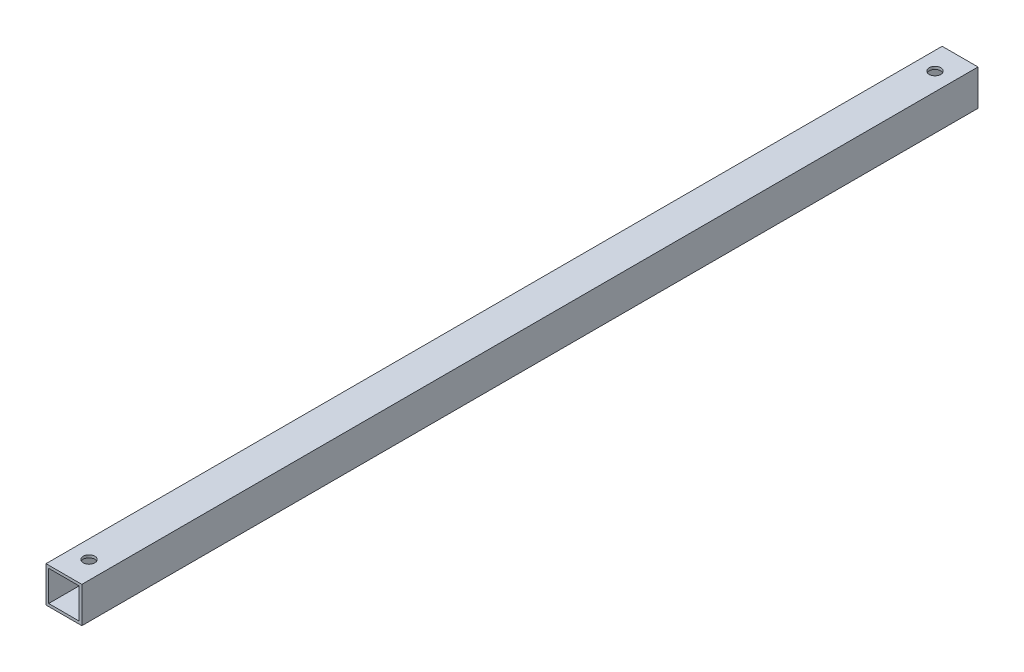
ISO-10303-21;
HEADER;
FILE_DESCRIPTION(('STEP AP214'),'2;1');
FILE_NAME('part.step','',(''),(''),'','','');
FILE_SCHEMA(('AUTOMOTIVE_DESIGN { 1 0 10303 214 1 1 1 1 }'));
ENDSEC;
DATA;
#1=APPLICATION_CONTEXT('core data for automotive mechanical design processes');
#2=APPLICATION_PROTOCOL_DEFINITION('international standard','automotive_design',2000,#1);
#3=PRODUCT_CONTEXT('',#1,'mechanical');
#4=PRODUCT('Part','Part','',(#3));
#5=PRODUCT_RELATED_PRODUCT_CATEGORY('part','',(#4));
#6=PRODUCT_DEFINITION_FORMATION('','',#4);
#7=PRODUCT_DEFINITION_CONTEXT('part definition',#1,'design');
#8=PRODUCT_DEFINITION('design','',#6,#7);
#9=PRODUCT_DEFINITION_SHAPE('','',#8);
#10=(LENGTH_UNIT() NAMED_UNIT(*) SI_UNIT(.MILLI.,.METRE.));
#11=(NAMED_UNIT(*) PLANE_ANGLE_UNIT() SI_UNIT($,.RADIAN.));
#12=(NAMED_UNIT(*) SI_UNIT($,.STERADIAN.) SOLID_ANGLE_UNIT());
#13=UNCERTAINTY_MEASURE_WITH_UNIT(LENGTH_MEASURE(1.E-05),#10,'distance_accuracy_value','');
#14=(GEOMETRIC_REPRESENTATION_CONTEXT(3) GLOBAL_UNCERTAINTY_ASSIGNED_CONTEXT((#13)) GLOBAL_UNIT_ASSIGNED_CONTEXT((#10,
#11,#12)) REPRESENTATION_CONTEXT('',''));
#15=CARTESIAN_POINT('',(0.,0.,0.));
#16=DIRECTION('',(0.,0.,1.));
#17=DIRECTION('',(1.,0.,0.));
#18=AXIS2_PLACEMENT_3D('',#15,#16,#17);
#19=CARTESIAN_POINT('',(-10.,-10.,-250.));
#20=DIRECTION('',(-1.,0.,0.));
#21=DIRECTION('',(0.,0.,1.));
#22=AXIS2_PLACEMENT_3D('',#19,#20,#21);
#23=PLANE('',#22);
#24=DIRECTION('',(0.,-1.,0.));
#25=VECTOR('',#24,1.);
#26=CARTESIAN_POINT('',(-10.,-10.,250.));
#27=LINE('',#26,#25);
#28=CARTESIAN_POINT('',(-10.,9.99999999999995,250.));
#29=VERTEX_POINT('',#28);
#30=CARTESIAN_POINT('',(-10.,-10.,250.));
#31=VERTEX_POINT('',#30);
#32=EDGE_CURVE('E134',#29,#31,#27,.T.);
#33=ORIENTED_EDGE('',*,*,#32,.F.);
#34=DIRECTION('',(0.,0.,1.));
#35=VECTOR('',#34,1.);
#36=CARTESIAN_POINT('',(-10.,9.99999999999995,-250.));
#37=LINE('',#36,#35);
#38=CARTESIAN_POINT('',(-10.,9.99999999999995,-250.));
#39=VERTEX_POINT('',#38);
#40=EDGE_CURVE('E11',#39,#29,#37,.T.);
#41=ORIENTED_EDGE('',*,*,#40,.F.);
#42=DIRECTION('',(0.,-1.,0.));
#43=VECTOR('',#42,1.);
#44=CARTESIAN_POINT('',(-10.,-10.,-250.));
#45=LINE('',#44,#43);
#46=CARTESIAN_POINT('',(-10.,-10.,-250.));
#47=VERTEX_POINT('',#46);
#48=EDGE_CURVE('E138',#39,#47,#45,.T.);
#49=ORIENTED_EDGE('',*,*,#48,.T.);
#50=DIRECTION('',(0.,0.,1.));
#51=VECTOR('',#50,1.);
#52=CARTESIAN_POINT('',(-10.,-10.,-250.));
#53=LINE('',#52,#51);
#54=EDGE_CURVE('E151',#47,#31,#53,.T.);
#55=ORIENTED_EDGE('',*,*,#54,.T.);
#56=EDGE_LOOP('',(#33,#41,#49,#55));
#57=FACE_BOUND('',#56,.T.);
#58=ADVANCED_FACE('F33',(#57),#23,.T.);
#59=CARTESIAN_POINT('',(9.99999999999997,9.99999999999995,-250.));
#60=DIRECTION('',(0.,1.,0.));
#61=DIRECTION('',(0.,0.,1.));
#62=AXIS2_PLACEMENT_3D('',#59,#60,#61);
#63=PLANE('',#62);
#64=CARTESIAN_POINT('',(0.,9.99999999999995,-236.));
#65=DIRECTION('',(0.,1.,0.));
#66=DIRECTION('',(0.,0.,1.));
#67=AXIS2_PLACEMENT_3D('',#64,#65,#66);
#68=CIRCLE('',#67,3.25);
#69=CARTESIAN_POINT('',(0.,9.99999999999995,-232.75));
#70=VERTEX_POINT('',#69);
#71=EDGE_CURVE('E168',#70,#70,#68,.T.);
#72=ORIENTED_EDGE('',*,*,#71,.F.);
#73=EDGE_LOOP('',(#72));
#74=FACE_BOUND('',#73,.T.);
#75=CARTESIAN_POINT('',(0.,9.99999999999995,236.));
#76=DIRECTION('',(0.,1.,0.));
#77=DIRECTION('',(0.,0.,1.));
#78=AXIS2_PLACEMENT_3D('',#75,#76,#77);
#79=CIRCLE('',#78,3.25);
#80=CARTESIAN_POINT('',(0.,9.99999999999995,239.25));
#81=VERTEX_POINT('',#80);
#82=EDGE_CURVE('E122',#81,#81,#79,.T.);
#83=ORIENTED_EDGE('',*,*,#82,.F.);
#84=EDGE_LOOP('',(#83));
#85=FACE_BOUND('',#84,.T.);
#86=DIRECTION('',(-1.,0.,0.));
#87=VECTOR('',#86,1.);
#88=CARTESIAN_POINT('',(9.99999999999997,9.99999999999995,250.));
#89=LINE('',#88,#87);
#90=CARTESIAN_POINT('',(9.99999999999997,9.99999999999995,250.));
#91=VERTEX_POINT('',#90);
#92=EDGE_CURVE('E142',#91,#29,#89,.T.);
#93=ORIENTED_EDGE('',*,*,#92,.F.);
#94=DIRECTION('',(0.,0.,1.));
#95=VECTOR('',#94,1.);
#96=CARTESIAN_POINT('',(9.99999999999997,9.99999999999995,-250.));
#97=LINE('',#96,#95);
#98=CARTESIAN_POINT('',(9.99999999999997,9.99999999999995,-250.));
#99=VERTEX_POINT('',#98);
#100=EDGE_CURVE('E41',#99,#91,#97,.T.);
#101=ORIENTED_EDGE('',*,*,#100,.F.);
#102=DIRECTION('',(-1.,0.,0.));
#103=VECTOR('',#102,1.);
#104=CARTESIAN_POINT('',(9.99999999999997,9.99999999999995,-250.));
#105=LINE('',#104,#103);
#106=EDGE_CURVE('E148',#99,#39,#105,.T.);
#107=ORIENTED_EDGE('',*,*,#106,.T.);
#108=ORIENTED_EDGE('',*,*,#40,.T.);
#109=EDGE_LOOP('',(#93,#101,#107,#108));
#110=FACE_BOUND('',#109,.T.);
#111=ADVANCED_FACE('F192',(#74,#85,#110),#63,.T.);
#112=CARTESIAN_POINT('',(9.99999999999998,-10.,-250.));
#113=DIRECTION('',(1.,0.,0.));
#114=DIRECTION('',(0.,1.,0.));
#115=AXIS2_PLACEMENT_3D('',#112,#113,#114);
#116=PLANE('',#115);
#117=DIRECTION('',(0.,1.,0.));
#118=VECTOR('',#117,1.);
#119=CARTESIAN_POINT('',(9.99999999999998,-10.,250.));
#120=LINE('',#119,#118);
#121=CARTESIAN_POINT('',(9.99999999999998,-10.,250.));
#122=VERTEX_POINT('',#121);
#123=EDGE_CURVE('E157',#122,#91,#120,.T.);
#124=ORIENTED_EDGE('',*,*,#123,.F.);
#125=DIRECTION('',(0.,0.,1.));
#126=VECTOR('',#125,1.);
#127=CARTESIAN_POINT('',(9.99999999999998,-10.,-250.));
#128=LINE('',#127,#126);
#129=CARTESIAN_POINT('',(9.99999999999998,-10.,-250.));
#130=VERTEX_POINT('',#129);
#131=EDGE_CURVE('E163',#130,#122,#128,.T.);
#132=ORIENTED_EDGE('',*,*,#131,.F.);
#133=DIRECTION('',(0.,1.,0.));
#134=VECTOR('',#133,1.);
#135=CARTESIAN_POINT('',(9.99999999999998,-10.,-250.));
#136=LINE('',#135,#134);
#137=EDGE_CURVE('E145',#130,#99,#136,.T.);
#138=ORIENTED_EDGE('',*,*,#137,.T.);
#139=ORIENTED_EDGE('',*,*,#100,.T.);
#140=EDGE_LOOP('',(#124,#132,#138,#139));
#141=FACE_BOUND('',#140,.T.);
#142=ADVANCED_FACE('F195',(#141),#116,.T.);
#143=CARTESIAN_POINT('',(9.99999999999998,-10.,-250.));
#144=DIRECTION('',(0.,-1.,0.));
#145=DIRECTION('',(1.,0.,0.));
#146=AXIS2_PLACEMENT_3D('',#143,#144,#145);
#147=PLANE('',#146);
#148=CARTESIAN_POINT('',(0.,-10.,-236.));
#149=DIRECTION('',(0.,-1.,0.));
#150=DIRECTION('',(1.,0.,0.));
#151=AXIS2_PLACEMENT_3D('',#148,#149,#150);
#152=CIRCLE('',#151,3.25);
#153=CARTESIAN_POINT('',(3.25,-10.,-236.));
#154=VERTEX_POINT('',#153);
#155=EDGE_CURVE('E175',#154,#154,#152,.T.);
#156=ORIENTED_EDGE('',*,*,#155,.F.);
#157=EDGE_LOOP('',(#156));
#158=FACE_BOUND('',#157,.T.);
#159=CARTESIAN_POINT('',(0.,-10.,236.));
#160=DIRECTION('',(0.,-1.,0.));
#161=DIRECTION('',(1.,0.,0.));
#162=AXIS2_PLACEMENT_3D('',#159,#160,#161);
#163=CIRCLE('',#162,3.25);
#164=CARTESIAN_POINT('',(3.25,-10.,236.));
#165=VERTEX_POINT('',#164);
#166=EDGE_CURVE('E172',#165,#165,#163,.T.);
#167=ORIENTED_EDGE('',*,*,#166,.F.);
#168=EDGE_LOOP('',(#167));
#169=FACE_BOUND('',#168,.T.);
#170=DIRECTION('',(1.,0.,0.));
#171=VECTOR('',#170,1.);
#172=CARTESIAN_POINT('',(9.99999999999998,-10.,250.));
#173=LINE('',#172,#171);
#174=EDGE_CURVE('E154',#31,#122,#173,.T.);
#175=ORIENTED_EDGE('',*,*,#174,.F.);
#176=ORIENTED_EDGE('',*,*,#54,.F.);
#177=DIRECTION('',(1.,0.,0.));
#178=VECTOR('',#177,1.);
#179=CARTESIAN_POINT('',(9.99999999999998,-10.,-250.));
#180=LINE('',#179,#178);
#181=EDGE_CURVE('E141',#47,#130,#180,.T.);
#182=ORIENTED_EDGE('',*,*,#181,.T.);
#183=ORIENTED_EDGE('',*,*,#131,.T.);
#184=EDGE_LOOP('',(#175,#176,#182,#183));
#185=FACE_BOUND('',#184,.T.);
#186=ADVANCED_FACE('F211',(#158,#169,#185),#147,.T.);
#187=CARTESIAN_POINT('',(-10.,9.99999999999995,-250.));
#188=DIRECTION('',(0.,0.,1.));
#189=DIRECTION('',(1.,0.,0.));
#190=AXIS2_PLACEMENT_3D('',#187,#188,#189);
#191=PLANE('',#190);
#192=DIRECTION('',(-1.,0.,0.));
#193=VECTOR('',#192,1.);
#194=CARTESIAN_POINT('',(8.5,8.5,-250.));
#195=LINE('',#194,#193);
#196=CARTESIAN_POINT('',(8.5,8.5,-250.));
#197=VERTEX_POINT('',#196);
#198=CARTESIAN_POINT('',(-8.5,8.5,-250.));
#199=VERTEX_POINT('',#198);
#200=EDGE_CURVE('E106',#197,#199,#195,.T.);
#201=ORIENTED_EDGE('',*,*,#200,.T.);
#202=DIRECTION('',(0.,-1.,0.));
#203=VECTOR('',#202,1.);
#204=CARTESIAN_POINT('',(-8.5,-8.5,-250.));
#205=LINE('',#204,#203);
#206=CARTESIAN_POINT('',(-8.5,-8.5,-250.));
#207=VERTEX_POINT('',#206);
#208=EDGE_CURVE('E100',#199,#207,#205,.T.);
#209=ORIENTED_EDGE('',*,*,#208,.T.);
#210=DIRECTION('',(1.,0.,0.));
#211=VECTOR('',#210,1.);
#212=CARTESIAN_POINT('',(8.5,-8.5,-250.));
#213=LINE('',#212,#211);
#214=CARTESIAN_POINT('',(8.5,-8.5,-250.));
#215=VERTEX_POINT('',#214);
#216=EDGE_CURVE('E109',#207,#215,#213,.T.);
#217=ORIENTED_EDGE('',*,*,#216,.T.);
#218=DIRECTION('',(0.,1.,0.));
#219=VECTOR('',#218,1.);
#220=CARTESIAN_POINT('',(8.5,-8.5,-250.));
#221=LINE('',#220,#219);
#222=EDGE_CURVE('E49',#215,#197,#221,.T.);
#223=ORIENTED_EDGE('',*,*,#222,.T.);
#224=EDGE_LOOP('',(#201,#209,#217,#223));
#225=FACE_BOUND('',#224,.T.);
#226=ORIENTED_EDGE('',*,*,#48,.F.);
#227=ORIENTED_EDGE('',*,*,#106,.F.);
#228=ORIENTED_EDGE('',*,*,#137,.F.);
#229=ORIENTED_EDGE('',*,*,#181,.F.);
#230=EDGE_LOOP('',(#226,#227,#228,#229));
#231=FACE_BOUND('',#230,.T.);
#232=ADVANCED_FACE('F113',(#225,#231),#191,.F.);
#233=CARTESIAN_POINT('',(-10.,9.99999999999995,250.));
#234=DIRECTION('',(0.,0.,1.));
#235=DIRECTION('',(1.,0.,0.));
#236=AXIS2_PLACEMENT_3D('',#233,#234,#235);
#237=PLANE('',#236);
#238=DIRECTION('',(0.,-1.,0.));
#239=VECTOR('',#238,1.);
#240=CARTESIAN_POINT('',(-8.5,-8.5,250.));
#241=LINE('',#240,#239);
#242=CARTESIAN_POINT('',(-8.5,8.5,250.));
#243=VERTEX_POINT('',#242);
#244=CARTESIAN_POINT('',(-8.5,-8.5,250.));
#245=VERTEX_POINT('',#244);
#246=EDGE_CURVE('E57',#243,#245,#241,.T.);
#247=ORIENTED_EDGE('',*,*,#246,.F.);
#248=DIRECTION('',(-1.,0.,0.));
#249=VECTOR('',#248,1.);
#250=CARTESIAN_POINT('',(8.5,8.5,250.));
#251=LINE('',#250,#249);
#252=CARTESIAN_POINT('',(8.5,8.5,250.));
#253=VERTEX_POINT('',#252);
#254=EDGE_CURVE('E116',#253,#243,#251,.T.);
#255=ORIENTED_EDGE('',*,*,#254,.F.);
#256=DIRECTION('',(0.,1.,0.));
#257=VECTOR('',#256,1.);
#258=CARTESIAN_POINT('',(8.5,-8.5,250.));
#259=LINE('',#258,#257);
#260=CARTESIAN_POINT('',(8.5,-8.5,250.));
#261=VERTEX_POINT('',#260);
#262=EDGE_CURVE('E119',#261,#253,#259,.T.);
#263=ORIENTED_EDGE('',*,*,#262,.F.);
#264=DIRECTION('',(1.,0.,0.));
#265=VECTOR('',#264,1.);
#266=CARTESIAN_POINT('',(8.5,-8.5,250.));
#267=LINE('',#266,#265);
#268=EDGE_CURVE('E128',#245,#261,#267,.T.);
#269=ORIENTED_EDGE('',*,*,#268,.F.);
#270=EDGE_LOOP('',(#247,#255,#263,#269));
#271=FACE_BOUND('',#270,.T.);
#272=ORIENTED_EDGE('',*,*,#32,.T.);
#273=ORIENTED_EDGE('',*,*,#174,.T.);
#274=ORIENTED_EDGE('',*,*,#123,.T.);
#275=ORIENTED_EDGE('',*,*,#92,.T.);
#276=EDGE_LOOP('',(#272,#273,#274,#275));
#277=FACE_BOUND('',#276,.T.);
#278=ADVANCED_FACE('F201',(#271,#277),#237,.T.);
#279=CARTESIAN_POINT('',(-8.5,-8.5,-250.));
#280=DIRECTION('',(-1.,0.,0.));
#281=DIRECTION('',(0.,0.,1.));
#282=AXIS2_PLACEMENT_3D('',#279,#280,#281);
#283=PLANE('',#282);
#284=ORIENTED_EDGE('',*,*,#246,.T.);
#285=DIRECTION('',(0.,0.,1.));
#286=VECTOR('',#285,1.);
#287=CARTESIAN_POINT('',(-8.5,-8.5,-250.));
#288=LINE('',#287,#286);
#289=EDGE_CURVE('E96',#207,#245,#288,.T.);
#290=ORIENTED_EDGE('',*,*,#289,.F.);
#291=ORIENTED_EDGE('',*,*,#208,.F.);
#292=DIRECTION('',(0.,0.,1.));
#293=VECTOR('',#292,1.);
#294=CARTESIAN_POINT('',(-8.5,8.5,-250.));
#295=LINE('',#294,#293);
#296=EDGE_CURVE('E132',#199,#243,#295,.T.);
#297=ORIENTED_EDGE('',*,*,#296,.T.);
#298=EDGE_LOOP('',(#284,#290,#291,#297));
#299=FACE_BOUND('',#298,.T.);
#300=ADVANCED_FACE('F98',(#299),#283,.F.);
#301=CARTESIAN_POINT('',(8.5,8.5,-250.));
#302=DIRECTION('',(0.,1.,0.));
#303=DIRECTION('',(0.,0.,1.));
#304=AXIS2_PLACEMENT_3D('',#301,#302,#303);
#305=PLANE('',#304);
#306=CARTESIAN_POINT('',(0.,8.5,-236.));
#307=DIRECTION('',(0.,1.,0.));
#308=DIRECTION('',(0.,0.,1.));
#309=AXIS2_PLACEMENT_3D('',#306,#307,#308);
#310=CIRCLE('',#309,3.25);
#311=CARTESIAN_POINT('',(0.,8.5,-232.75));
#312=VERTEX_POINT('',#311);
#313=EDGE_CURVE('E180',#312,#312,#310,.T.);
#314=ORIENTED_EDGE('',*,*,#313,.T.);
#315=EDGE_LOOP('',(#314));
#316=FACE_BOUND('',#315,.T.);
#317=CARTESIAN_POINT('',(0.,8.5,236.));
#318=DIRECTION('',(0.,1.,0.));
#319=DIRECTION('',(0.,0.,1.));
#320=AXIS2_PLACEMENT_3D('',#317,#318,#319);
#321=CIRCLE('',#320,3.25);
#322=CARTESIAN_POINT('',(0.,8.5,239.25));
#323=VERTEX_POINT('',#322);
#324=EDGE_CURVE('E167',#323,#323,#321,.T.);
#325=ORIENTED_EDGE('',*,*,#324,.T.);
#326=EDGE_LOOP('',(#325));
#327=FACE_BOUND('',#326,.T.);
#328=ORIENTED_EDGE('',*,*,#254,.T.);
#329=ORIENTED_EDGE('',*,*,#296,.F.);
#330=ORIENTED_EDGE('',*,*,#200,.F.);
#331=DIRECTION('',(0.,0.,1.));
#332=VECTOR('',#331,1.);
#333=CARTESIAN_POINT('',(8.5,8.5,-250.));
#334=LINE('',#333,#332);
#335=EDGE_CURVE('E135',#197,#253,#334,.T.);
#336=ORIENTED_EDGE('',*,*,#335,.T.);
#337=EDGE_LOOP('',(#328,#329,#330,#336));
#338=FACE_BOUND('',#337,.T.);
#339=ADVANCED_FACE('F258',(#316,#327,#338),#305,.F.);
#340=CARTESIAN_POINT('',(8.5,-8.5,-250.));
#341=DIRECTION('',(1.,0.,0.));
#342=DIRECTION('',(0.,0.,-1.));
#343=AXIS2_PLACEMENT_3D('',#340,#341,#342);
#344=PLANE('',#343);
#345=ORIENTED_EDGE('',*,*,#262,.T.);
#346=ORIENTED_EDGE('',*,*,#335,.F.);
#347=ORIENTED_EDGE('',*,*,#222,.F.);
#348=DIRECTION('',(0.,0.,1.));
#349=VECTOR('',#348,1.);
#350=CARTESIAN_POINT('',(8.5,-8.5,-250.));
#351=LINE('',#350,#349);
#352=EDGE_CURVE('E105',#215,#261,#351,.T.);
#353=ORIENTED_EDGE('',*,*,#352,.T.);
#354=EDGE_LOOP('',(#345,#346,#347,#353));
#355=FACE_BOUND('',#354,.T.);
#356=ADVANCED_FACE('F265',(#355),#344,.F.);
#357=CARTESIAN_POINT('',(8.5,-8.5,-250.));
#358=DIRECTION('',(0.,-1.,0.));
#359=DIRECTION('',(0.,0.,-1.));
#360=AXIS2_PLACEMENT_3D('',#357,#358,#359);
#361=PLANE('',#360);
#362=CARTESIAN_POINT('',(0.,-8.5,-236.));
#363=DIRECTION('',(0.,-1.,0.));
#364=DIRECTION('',(0.,0.,-1.));
#365=AXIS2_PLACEMENT_3D('',#362,#363,#364);
#366=CIRCLE('',#365,3.25);
#367=CARTESIAN_POINT('',(0.,-8.5,-239.25));
#368=VERTEX_POINT('',#367);
#369=EDGE_CURVE('E36',#368,#368,#366,.T.);
#370=ORIENTED_EDGE('',*,*,#369,.T.);
#371=EDGE_LOOP('',(#370));
#372=FACE_BOUND('',#371,.T.);
#373=CARTESIAN_POINT('',(0.,-8.5,236.));
#374=DIRECTION('',(0.,-1.,0.));
#375=DIRECTION('',(0.,0.,-1.));
#376=AXIS2_PLACEMENT_3D('',#373,#374,#375);
#377=CIRCLE('',#376,3.25);
#378=CARTESIAN_POINT('',(0.,-8.5,232.75));
#379=VERTEX_POINT('',#378);
#380=EDGE_CURVE('E165',#379,#379,#377,.T.);
#381=ORIENTED_EDGE('',*,*,#380,.T.);
#382=EDGE_LOOP('',(#381));
#383=FACE_BOUND('',#382,.T.);
#384=ORIENTED_EDGE('',*,*,#268,.T.);
#385=ORIENTED_EDGE('',*,*,#352,.F.);
#386=ORIENTED_EDGE('',*,*,#216,.F.);
#387=ORIENTED_EDGE('',*,*,#289,.T.);
#388=EDGE_LOOP('',(#384,#385,#386,#387));
#389=FACE_BOUND('',#388,.T.);
#390=ADVANCED_FACE('F110',(#372,#383,#389),#361,.F.);
#391=CARTESIAN_POINT('',(0.,-15.,236.));
#392=DIRECTION('',(0.,1.,0.));
#393=DIRECTION('',(0.,0.,1.));
#394=AXIS2_PLACEMENT_3D('',#391,#392,#393);
#395=CYLINDRICAL_SURFACE('',#394,3.25);
#396=ORIENTED_EDGE('',*,*,#166,.T.);
#397=EDGE_LOOP('',(#396));
#398=FACE_BOUND('',#397,.T.);
#399=ORIENTED_EDGE('',*,*,#380,.F.);
#400=EDGE_LOOP('',(#399));
#401=FACE_BOUND('',#400,.T.);
#402=ADVANCED_FACE('F280',(#398,#401),#395,.F.);
#403=ORIENTED_EDGE('',*,*,#82,.T.);
#404=EDGE_LOOP('',(#403));
#405=FACE_BOUND('',#404,.T.);
#406=ORIENTED_EDGE('',*,*,#324,.F.);
#407=EDGE_LOOP('',(#406));
#408=FACE_BOUND('',#407,.T.);
#409=ADVANCED_FACE('F189',(#405,#408),#395,.F.);
#410=CARTESIAN_POINT('',(0.,-15.,-236.));
#411=DIRECTION('',(0.,1.,0.));
#412=DIRECTION('',(0.,0.,1.));
#413=AXIS2_PLACEMENT_3D('',#410,#411,#412);
#414=CYLINDRICAL_SURFACE('',#413,3.25);
#415=ORIENTED_EDGE('',*,*,#155,.T.);
#416=EDGE_LOOP('',(#415));
#417=FACE_BOUND('',#416,.T.);
#418=ORIENTED_EDGE('',*,*,#369,.F.);
#419=EDGE_LOOP('',(#418));
#420=FACE_BOUND('',#419,.T.);
#421=ADVANCED_FACE('F293',(#417,#420),#414,.F.);
#422=ORIENTED_EDGE('',*,*,#71,.T.);
#423=EDGE_LOOP('',(#422));
#424=FACE_BOUND('',#423,.T.);
#425=ORIENTED_EDGE('',*,*,#313,.F.);
#426=EDGE_LOOP('',(#425));
#427=FACE_BOUND('',#426,.T.);
#428=ADVANCED_FACE('F299',(#424,#427),#414,.F.);
#429=CLOSED_SHELL('',(#58,#111,#142,#186,#232,#278,#300,#339,#356,#390,#402,#409,#421,#428));
#430=MANIFOLD_SOLID_BREP('B2',#429);
#431=ADVANCED_BREP_SHAPE_REPRESENTATION('',(#18,#430),#14);
#432=SHAPE_DEFINITION_REPRESENTATION(#9,#431);
ENDSEC;
END-ISO-10303-21;
